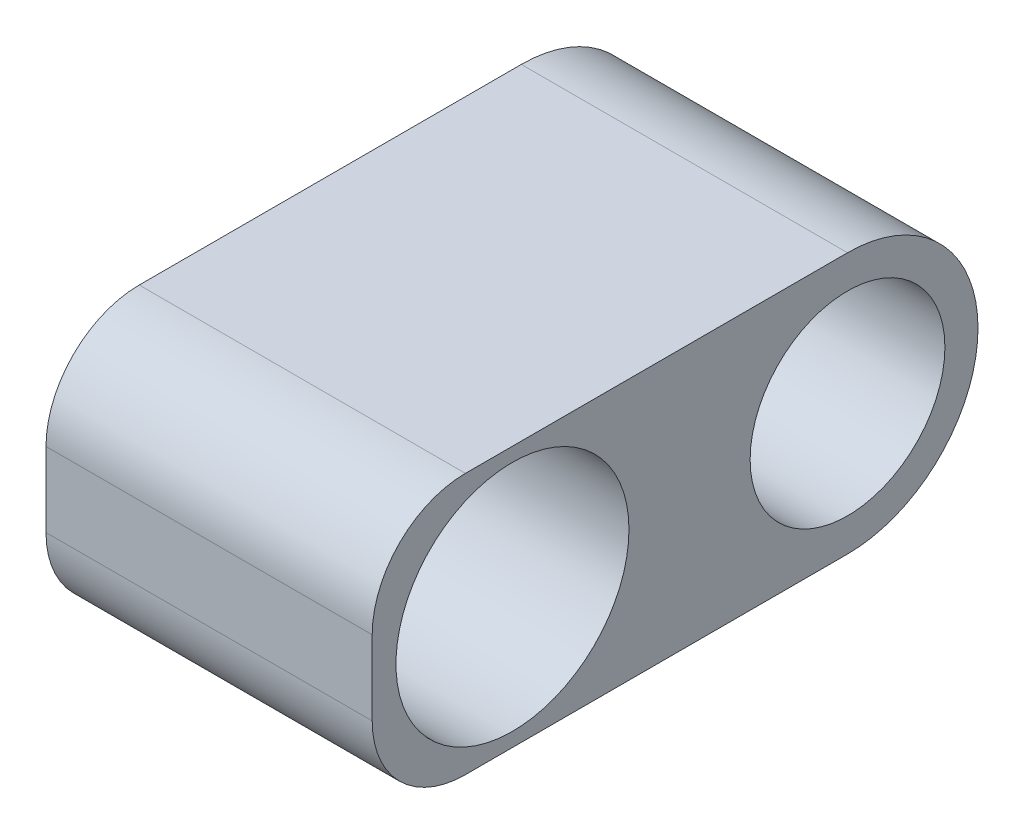
ISO-10303-21;
HEADER;
FILE_DESCRIPTION(('STEP AP214'),'2;1');
FILE_NAME('part.step','',(''),(''),'','','');
FILE_SCHEMA(('AUTOMOTIVE_DESIGN { 1 0 10303 214 1 1 1 1 }'));
ENDSEC;
DATA;
#1=APPLICATION_CONTEXT('core data for automotive mechanical design processes');
#2=APPLICATION_PROTOCOL_DEFINITION('international standard','automotive_design',2000,#1);
#3=PRODUCT_CONTEXT('',#1,'mechanical');
#4=PRODUCT('Part','Part','',(#3));
#5=PRODUCT_RELATED_PRODUCT_CATEGORY('part','',(#4));
#6=PRODUCT_DEFINITION_FORMATION('','',#4);
#7=PRODUCT_DEFINITION_CONTEXT('part definition',#1,'design');
#8=PRODUCT_DEFINITION('design','',#6,#7);
#9=PRODUCT_DEFINITION_SHAPE('','',#8);
#10=(LENGTH_UNIT() NAMED_UNIT(*) SI_UNIT(.MILLI.,.METRE.));
#11=(NAMED_UNIT(*) PLANE_ANGLE_UNIT() SI_UNIT($,.RADIAN.));
#12=(NAMED_UNIT(*) SI_UNIT($,.STERADIAN.) SOLID_ANGLE_UNIT());
#13=UNCERTAINTY_MEASURE_WITH_UNIT(LENGTH_MEASURE(1.E-05),#10,'distance_accuracy_value','');
#14=(GEOMETRIC_REPRESENTATION_CONTEXT(3) GLOBAL_UNCERTAINTY_ASSIGNED_CONTEXT((#13)) GLOBAL_UNIT_ASSIGNED_CONTEXT((#10,
#11,#12)) REPRESENTATION_CONTEXT('',''));
#15=CARTESIAN_POINT('',(0.,0.,0.));
#16=DIRECTION('',(0.,0.,1.));
#17=DIRECTION('',(1.,0.,0.));
#18=AXIS2_PLACEMENT_3D('',#15,#16,#17);
#19=CARTESIAN_POINT('',(-17.,-4.0000000000191,41.0000000000019));
#20=DIRECTION('',(1.,0.,0.));
#21=DIRECTION('',(0.,0.,-1.));
#22=AXIS2_PLACEMENT_3D('',#19,#20,#21);
#23=CYLINDRICAL_SURFACE('',#22,10.);
#24=DIRECTION('',(1.,0.,0.));
#25=VECTOR('',#24,1.);
#26=CARTESIAN_POINT('',(-17.,-4.0000000000191,51.0000000000019));
#27=LINE('',#26,#25);
#28=CARTESIAN_POINT('',(-17.,-4.0000000000191,51.0000000000019));
#29=VERTEX_POINT('',#28);
#30=CARTESIAN_POINT('',(18.,-4.0000000000191,51.0000000000019));
#31=VERTEX_POINT('',#30);
#32=EDGE_CURVE('E133',#29,#31,#27,.T.);
#33=ORIENTED_EDGE('',*,*,#32,.F.);
#34=CARTESIAN_POINT('',(-17.,-4.0000000000191,41.0000000000019));
#35=DIRECTION('',(-1.,0.,0.));
#36=DIRECTION('',(0.,0.,1.));
#37=AXIS2_PLACEMENT_3D('',#34,#35,#36);
#38=CIRCLE('',#37,10.);
#39=CARTESIAN_POINT('',(-17.,-14.00000000001,40.9999999999968));
#40=VERTEX_POINT('',#39);
#41=EDGE_CURVE('E46',#40,#29,#38,.T.);
#42=ORIENTED_EDGE('',*,*,#41,.F.);
#43=DIRECTION('',(1.,0.,0.));
#44=VECTOR('',#43,1.);
#45=CARTESIAN_POINT('',(-17.,-14.00000000001,40.9999999999968));
#46=LINE('',#45,#44);
#47=CARTESIAN_POINT('',(18.,-14.00000000001,40.9999999999968));
#48=VERTEX_POINT('',#47);
#49=EDGE_CURVE('E136',#48,#40,#46,.F.);
#50=ORIENTED_EDGE('',*,*,#49,.F.);
#51=CARTESIAN_POINT('',(18.,-4.0000000000191,41.0000000000019));
#52=DIRECTION('',(-1.,0.,0.));
#53=DIRECTION('',(0.,0.,1.));
#54=AXIS2_PLACEMENT_3D('',#51,#52,#53);
#55=CIRCLE('',#54,10.);
#56=EDGE_CURVE('E11',#31,#48,#55,.F.);
#57=ORIENTED_EDGE('',*,*,#56,.F.);
#58=EDGE_LOOP('',(#33,#42,#50,#57));
#59=FACE_BOUND('',#58,.T.);
#60=ADVANCED_FACE('F39',(#59),#23,.T.);
#61=CARTESIAN_POINT('',(-17.,4.0000000000191,41.0000000000019));
#62=DIRECTION('',(-1.,0.,0.));
#63=DIRECTION('',(0.,0.,1.));
#64=AXIS2_PLACEMENT_3D('',#61,#62,#63);
#65=CYLINDRICAL_SURFACE('',#64,10.);
#66=DIRECTION('',(-1.,0.,0.));
#67=VECTOR('',#66,1.);
#68=CARTESIAN_POINT('',(-17.,4.0000000000191,51.0000000000019));
#69=LINE('',#68,#67);
#70=CARTESIAN_POINT('',(18.,4.0000000000191,51.0000000000019));
#71=VERTEX_POINT('',#70);
#72=CARTESIAN_POINT('',(-17.,4.0000000000191,51.0000000000019));
#73=VERTEX_POINT('',#72);
#74=EDGE_CURVE('E121',#71,#73,#69,.T.);
#75=ORIENTED_EDGE('',*,*,#74,.F.);
#76=CARTESIAN_POINT('',(18.,4.0000000000191,41.0000000000019));
#77=DIRECTION('',(-1.,0.,0.));
#78=DIRECTION('',(0.,0.,1.));
#79=AXIS2_PLACEMENT_3D('',#76,#77,#78);
#80=CIRCLE('',#79,10.);
#81=CARTESIAN_POINT('',(18.,14.00000000001,40.9999999999968));
#82=VERTEX_POINT('',#81);
#83=EDGE_CURVE('E132',#82,#71,#80,.F.);
#84=ORIENTED_EDGE('',*,*,#83,.F.);
#85=DIRECTION('',(-1.,0.,0.));
#86=VECTOR('',#85,1.);
#87=CARTESIAN_POINT('',(-17.,14.00000000001,40.9999999999968));
#88=LINE('',#87,#86);
#89=CARTESIAN_POINT('',(-17.,14.00000000001,40.9999999999968));
#90=VERTEX_POINT('',#89);
#91=EDGE_CURVE('E130',#90,#82,#88,.F.);
#92=ORIENTED_EDGE('',*,*,#91,.F.);
#93=CARTESIAN_POINT('',(-17.,4.0000000000191,41.0000000000019));
#94=DIRECTION('',(-1.,0.,0.));
#95=DIRECTION('',(0.,0.,1.));
#96=AXIS2_PLACEMENT_3D('',#93,#94,#95);
#97=CIRCLE('',#96,10.);
#98=EDGE_CURVE('E135',#73,#90,#97,.T.);
#99=ORIENTED_EDGE('',*,*,#98,.F.);
#100=EDGE_LOOP('',(#75,#84,#92,#99));
#101=FACE_BOUND('',#100,.T.);
#102=ADVANCED_FACE('F149',(#101),#65,.T.);
#103=CARTESIAN_POINT('',(-17.,-14.00000000001,116758.401593134));
#104=DIRECTION('',(0.,-1.,0.));
#105=DIRECTION('',(0.,0.,-1.));
#106=AXIS2_PLACEMENT_3D('',#103,#104,#105);
#107=PLANE('',#106);
#108=DIRECTION('',(0.,0.,-1.));
#109=VECTOR('',#108,1.);
#110=CARTESIAN_POINT('',(18.,-14.00000000001,116758.401593134));
#111=LINE('',#110,#109);
#112=CARTESIAN_POINT('',(18.,-14.,0.));
#113=VERTEX_POINT('',#112);
#114=EDGE_CURVE('E89',#48,#113,#111,.T.);
#115=ORIENTED_EDGE('',*,*,#114,.F.);
#116=ORIENTED_EDGE('',*,*,#49,.T.);
#117=DIRECTION('',(0.,0.,-1.));
#118=VECTOR('',#117,1.);
#119=CARTESIAN_POINT('',(-17.,-14.00000000001,116758.401593134));
#120=LINE('',#119,#118);
#121=CARTESIAN_POINT('',(-17.,-14.,0.));
#122=VERTEX_POINT('',#121);
#123=EDGE_CURVE('E99',#40,#122,#120,.T.);
#124=ORIENTED_EDGE('',*,*,#123,.T.);
#125=DIRECTION('',(1.,0.,0.));
#126=VECTOR('',#125,1.);
#127=CARTESIAN_POINT('',(-17.,-14.,0.));
#128=LINE('',#127,#126);
#129=EDGE_CURVE('E97',#122,#113,#128,.T.);
#130=ORIENTED_EDGE('',*,*,#129,.T.);
#131=EDGE_LOOP('',(#115,#116,#124,#130));
#132=FACE_BOUND('',#131,.T.);
#133=ADVANCED_FACE('F96',(#132),#107,.T.);
#134=CARTESIAN_POINT('',(-17.,-481034.717744328,51.0000000000019));
#135=DIRECTION('',(0.,0.,1.));
#136=DIRECTION('',(1.,0.,0.));
#137=AXIS2_PLACEMENT_3D('',#134,#135,#136);
#138=PLANE('',#137);
#139=DIRECTION('',(0.,-1.,0.));
#140=VECTOR('',#139,1.);
#141=CARTESIAN_POINT('',(-17.,-481034.717744328,51.0000000000019));
#142=LINE('',#141,#140);
#143=EDGE_CURVE('E102',#73,#29,#142,.T.);
#144=ORIENTED_EDGE('',*,*,#143,.T.);
#145=ORIENTED_EDGE('',*,*,#32,.T.);
#146=DIRECTION('',(0.,-1.,0.));
#147=VECTOR('',#146,1.);
#148=CARTESIAN_POINT('',(18.,-481034.717744328,51.0000000000019));
#149=LINE('',#148,#147);
#150=EDGE_CURVE('E111',#71,#31,#149,.T.);
#151=ORIENTED_EDGE('',*,*,#150,.F.);
#152=ORIENTED_EDGE('',*,*,#74,.T.);
#153=EDGE_LOOP('',(#144,#145,#151,#152));
#154=FACE_BOUND('',#153,.T.);
#155=ADVANCED_FACE('F144',(#154),#138,.T.);
#156=CARTESIAN_POINT('',(-17.,14.00000000001,116758.401593134));
#157=DIRECTION('',(0.,1.,0.));
#158=DIRECTION('',(0.,0.,1.));
#159=AXIS2_PLACEMENT_3D('',#156,#157,#158);
#160=PLANE('',#159);
#161=DIRECTION('',(0.,0.,1.));
#162=VECTOR('',#161,1.);
#163=CARTESIAN_POINT('',(-17.,14.00000000001,116758.401593134));
#164=LINE('',#163,#162);
#165=CARTESIAN_POINT('',(-17.,14.00000000001,0.));
#166=VERTEX_POINT('',#165);
#167=EDGE_CURVE('E118',#166,#90,#164,.T.);
#168=ORIENTED_EDGE('',*,*,#167,.T.);
#169=ORIENTED_EDGE('',*,*,#91,.T.);
#170=DIRECTION('',(0.,0.,1.));
#171=VECTOR('',#170,1.);
#172=CARTESIAN_POINT('',(18.,14.00000000001,116758.401593134));
#173=LINE('',#172,#171);
#174=CARTESIAN_POINT('',(18.,14.00000000001,0.));
#175=VERTEX_POINT('',#174);
#176=EDGE_CURVE('E107',#175,#82,#173,.T.);
#177=ORIENTED_EDGE('',*,*,#176,.F.);
#178=DIRECTION('',(1.,0.,0.));
#179=VECTOR('',#178,1.);
#180=CARTESIAN_POINT('',(-17.,14.00000000001,0.));
#181=LINE('',#180,#179);
#182=EDGE_CURVE('E104',#166,#175,#181,.T.);
#183=ORIENTED_EDGE('',*,*,#182,.F.);
#184=EDGE_LOOP('',(#168,#169,#177,#183));
#185=FACE_BOUND('',#184,.T.);
#186=ADVANCED_FACE('F152',(#185),#160,.T.);
#187=CARTESIAN_POINT('',(-17.,0.,0.));
#188=DIRECTION('',(1.,0.,0.));
#189=DIRECTION('',(0.,0.,-1.));
#190=AXIS2_PLACEMENT_3D('',#187,#188,#189);
#191=CYLINDRICAL_SURFACE('',#190,14.);
#192=ORIENTED_EDGE('',*,*,#182,.T.);
#193=CARTESIAN_POINT('',(18.,0.,0.));
#194=DIRECTION('',(-1.,0.,0.));
#195=DIRECTION('',(0.,0.,1.));
#196=AXIS2_PLACEMENT_3D('',#193,#194,#195);
#197=CIRCLE('',#196,14.);
#198=EDGE_CURVE('E95',#175,#113,#197,.T.);
#199=ORIENTED_EDGE('',*,*,#198,.T.);
#200=ORIENTED_EDGE('',*,*,#129,.F.);
#201=CARTESIAN_POINT('',(-17.,0.,0.));
#202=DIRECTION('',(-1.,0.,0.));
#203=DIRECTION('',(0.,0.,1.));
#204=AXIS2_PLACEMENT_3D('',#201,#202,#203);
#205=CIRCLE('',#204,14.);
#206=EDGE_CURVE('E120',#166,#122,#205,.T.);
#207=ORIENTED_EDGE('',*,*,#206,.F.);
#208=EDGE_LOOP('',(#192,#199,#200,#207));
#209=FACE_BOUND('',#208,.T.);
#210=ADVANCED_FACE('F110',(#209),#191,.T.);
#211=CARTESIAN_POINT('',(-17.,0.,0.));
#212=DIRECTION('',(-1.,0.,0.));
#213=DIRECTION('',(0.,0.,1.));
#214=AXIS2_PLACEMENT_3D('',#211,#212,#213);
#215=PLANE('',#214);
#216=CARTESIAN_POINT('',(-17.,0.,35.95));
#217=DIRECTION('',(1.,0.,0.));
#218=DIRECTION('',(0.,0.,-1.));
#219=AXIS2_PLACEMENT_3D('',#216,#217,#218);
#220=CIRCLE('',#219,12.5);
#221=CARTESIAN_POINT('',(-17.,0.,23.45));
#222=VERTEX_POINT('',#221);
#223=EDGE_CURVE('E250',#222,#222,#220,.T.);
#224=ORIENTED_EDGE('',*,*,#223,.T.);
#225=EDGE_LOOP('',(#224));
#226=FACE_BOUND('',#225,.T.);
#227=CARTESIAN_POINT('',(-17.,0.,0.));
#228=DIRECTION('',(1.,0.,0.));
#229=DIRECTION('',(0.,0.,-1.));
#230=AXIS2_PLACEMENT_3D('',#227,#228,#229);
#231=CIRCLE('',#230,6.5);
#232=CARTESIAN_POINT('',(-17.,0.,-6.5));
#233=VERTEX_POINT('',#232);
#234=EDGE_CURVE('E253',#233,#233,#231,.T.);
#235=ORIENTED_EDGE('',*,*,#234,.T.);
#236=EDGE_LOOP('',(#235));
#237=FACE_BOUND('',#236,.T.);
#238=ORIENTED_EDGE('',*,*,#123,.F.);
#239=ORIENTED_EDGE('',*,*,#41,.T.);
#240=ORIENTED_EDGE('',*,*,#143,.F.);
#241=ORIENTED_EDGE('',*,*,#98,.T.);
#242=ORIENTED_EDGE('',*,*,#167,.F.);
#243=ORIENTED_EDGE('',*,*,#206,.T.);
#244=EDGE_LOOP('',(#238,#239,#240,#241,#242,#243));
#245=FACE_BOUND('',#244,.T.);
#246=ADVANCED_FACE('F142',(#226,#237,#245),#215,.T.);
#247=CARTESIAN_POINT('',(18.,0.,0.));
#248=DIRECTION('',(-1.,0.,0.));
#249=DIRECTION('',(0.,0.,1.));
#250=AXIS2_PLACEMENT_3D('',#247,#248,#249);
#251=PLANE('',#250);
#252=CARTESIAN_POINT('',(18.,0.,35.95));
#253=DIRECTION('',(1.,0.,0.));
#254=DIRECTION('',(0.,0.,-1.));
#255=AXIS2_PLACEMENT_3D('',#252,#253,#254);
#256=CIRCLE('',#255,12.5);
#257=CARTESIAN_POINT('',(18.,0.,23.45));
#258=VERTEX_POINT('',#257);
#259=EDGE_CURVE('E249',#258,#258,#256,.T.);
#260=ORIENTED_EDGE('',*,*,#259,.F.);
#261=EDGE_LOOP('',(#260));
#262=FACE_BOUND('',#261,.T.);
#263=CARTESIAN_POINT('',(18.,0.,0.));
#264=DIRECTION('',(1.,0.,0.));
#265=DIRECTION('',(0.,0.,-1.));
#266=AXIS2_PLACEMENT_3D('',#263,#264,#265);
#267=CIRCLE('',#266,10.45);
#268=CARTESIAN_POINT('',(18.,0.,-10.45));
#269=VERTEX_POINT('',#268);
#270=EDGE_CURVE('E260',#269,#269,#267,.T.);
#271=ORIENTED_EDGE('',*,*,#270,.F.);
#272=EDGE_LOOP('',(#271));
#273=FACE_BOUND('',#272,.T.);
#274=ORIENTED_EDGE('',*,*,#150,.T.);
#275=ORIENTED_EDGE('',*,*,#56,.T.);
#276=ORIENTED_EDGE('',*,*,#114,.T.);
#277=ORIENTED_EDGE('',*,*,#198,.F.);
#278=ORIENTED_EDGE('',*,*,#176,.T.);
#279=ORIENTED_EDGE('',*,*,#83,.T.);
#280=EDGE_LOOP('',(#274,#275,#276,#277,#278,#279));
#281=FACE_BOUND('',#280,.T.);
#282=ADVANCED_FACE('F86',(#262,#273,#281),#251,.F.);
#283=CARTESIAN_POINT('',(-14.,0.,0.));
#284=DIRECTION('',(1.,0.,0.));
#285=DIRECTION('',(0.,0.,-1.));
#286=AXIS2_PLACEMENT_3D('',#283,#284,#285);
#287=CYLINDRICAL_SURFACE('',#286,10.45);
#288=CARTESIAN_POINT('',(-14.,0.,0.));
#289=DIRECTION('',(1.,0.,0.));
#290=DIRECTION('',(0.,0.,-1.));
#291=AXIS2_PLACEMENT_3D('',#288,#289,#290);
#292=CIRCLE('',#291,10.45);
#293=CARTESIAN_POINT('',(-14.,0.,-10.45));
#294=VERTEX_POINT('',#293);
#295=EDGE_CURVE('E94',#294,#294,#292,.T.);
#296=ORIENTED_EDGE('',*,*,#295,.F.);
#297=EDGE_LOOP('',(#296));
#298=FACE_BOUND('',#297,.T.);
#299=ORIENTED_EDGE('',*,*,#270,.T.);
#300=EDGE_LOOP('',(#299));
#301=FACE_BOUND('',#300,.T.);
#302=ADVANCED_FACE('F192',(#298,#301),#287,.F.);
#303=CARTESIAN_POINT('',(-14.,0.,0.));
#304=DIRECTION('',(1.,0.,0.));
#305=DIRECTION('',(0.,0.,-1.));
#306=AXIS2_PLACEMENT_3D('',#303,#304,#305);
#307=PLANE('',#306);
#308=CARTESIAN_POINT('',(-14.,0.,0.));
#309=DIRECTION('',(1.,0.,0.));
#310=DIRECTION('',(0.,0.,-1.));
#311=AXIS2_PLACEMENT_3D('',#308,#309,#310);
#312=CIRCLE('',#311,6.5);
#313=CARTESIAN_POINT('',(-14.,0.,-6.5));
#314=VERTEX_POINT('',#313);
#315=EDGE_CURVE('E255',#314,#314,#312,.T.);
#316=ORIENTED_EDGE('',*,*,#315,.F.);
#317=EDGE_LOOP('',(#316));
#318=FACE_BOUND('',#317,.T.);
#319=ORIENTED_EDGE('',*,*,#295,.T.);
#320=EDGE_LOOP('',(#319));
#321=FACE_BOUND('',#320,.T.);
#322=ADVANCED_FACE('F204',(#318,#321),#307,.T.);
#323=CARTESIAN_POINT('',(-17.,0.,0.));
#324=DIRECTION('',(1.,0.,0.));
#325=DIRECTION('',(0.,0.,-1.));
#326=AXIS2_PLACEMENT_3D('',#323,#324,#325);
#327=CYLINDRICAL_SURFACE('',#326,6.5);
#328=CARTESIAN_POINT('',(-17.,0.,-6.5));
#329=CARTESIAN_POINT('',(-16.96875,0.,-6.5));
#330=CARTESIAN_POINT('',(-16.9375,0.,-6.5));
#331=CARTESIAN_POINT('',(-16.875,0.,-6.5));
#332=CARTESIAN_POINT('',(-16.84375,0.,-6.5));
#333=CARTESIAN_POINT('',(-16.78125,0.,-6.5));
#334=CARTESIAN_POINT('',(-16.75,0.,-6.5));
#335=CARTESIAN_POINT('',(-16.6875,0.,-6.5));
#336=CARTESIAN_POINT('',(-16.65625,0.,-6.5));
#337=CARTESIAN_POINT('',(-16.59375,0.,-6.5));
#338=CARTESIAN_POINT('',(-16.5625,0.,-6.5));
#339=CARTESIAN_POINT('',(-16.5,0.,-6.5));
#340=CARTESIAN_POINT('',(-16.46875,0.,-6.5));
#341=CARTESIAN_POINT('',(-16.40625,0.,-6.5));
#342=CARTESIAN_POINT('',(-16.375,0.,-6.5));
#343=CARTESIAN_POINT('',(-16.3125,0.,-6.5));
#344=CARTESIAN_POINT('',(-16.28125,0.,-6.5));
#345=CARTESIAN_POINT('',(-16.21875,0.,-6.5));
#346=CARTESIAN_POINT('',(-16.1875,0.,-6.5));
#347=CARTESIAN_POINT('',(-16.125,0.,-6.5));
#348=CARTESIAN_POINT('',(-16.09375,0.,-6.5));
#349=CARTESIAN_POINT('',(-16.03125,0.,-6.5));
#350=CARTESIAN_POINT('',(-16.,0.,-6.5));
#351=CARTESIAN_POINT('',(-15.9375,0.,-6.5));
#352=CARTESIAN_POINT('',(-15.90625,0.,-6.5));
#353=CARTESIAN_POINT('',(-15.84375,0.,-6.5));
#354=CARTESIAN_POINT('',(-15.8125,0.,-6.5));
#355=CARTESIAN_POINT('',(-15.75,0.,-6.5));
#356=CARTESIAN_POINT('',(-15.71875,0.,-6.5));
#357=CARTESIAN_POINT('',(-15.65625,0.,-6.5));
#358=CARTESIAN_POINT('',(-15.625,0.,-6.5));
#359=CARTESIAN_POINT('',(-15.5625,0.,-6.5));
#360=CARTESIAN_POINT('',(-15.53125,0.,-6.5));
#361=CARTESIAN_POINT('',(-15.46875,0.,-6.5));
#362=CARTESIAN_POINT('',(-15.4375,0.,-6.5));
#363=CARTESIAN_POINT('',(-15.375,0.,-6.5));
#364=CARTESIAN_POINT('',(-15.34375,0.,-6.5));
#365=CARTESIAN_POINT('',(-15.28125,0.,-6.5));
#366=CARTESIAN_POINT('',(-15.25,0.,-6.5));
#367=CARTESIAN_POINT('',(-15.1875,0.,-6.5));
#368=CARTESIAN_POINT('',(-15.15625,0.,-6.5));
#369=CARTESIAN_POINT('',(-15.09375,0.,-6.5));
#370=CARTESIAN_POINT('',(-15.0625,0.,-6.5));
#371=CARTESIAN_POINT('',(-15.,0.,-6.5));
#372=CARTESIAN_POINT('',(-14.96875,0.,-6.5));
#373=CARTESIAN_POINT('',(-14.90625,0.,-6.5));
#374=CARTESIAN_POINT('',(-14.875,0.,-6.5));
#375=CARTESIAN_POINT('',(-14.8125,0.,-6.5));
#376=CARTESIAN_POINT('',(-14.78125,0.,-6.5));
#377=CARTESIAN_POINT('',(-14.71875,0.,-6.5));
#378=CARTESIAN_POINT('',(-14.6875,0.,-6.5));
#379=CARTESIAN_POINT('',(-14.625,0.,-6.5));
#380=CARTESIAN_POINT('',(-14.59375,0.,-6.5));
#381=CARTESIAN_POINT('',(-14.53125,0.,-6.5));
#382=CARTESIAN_POINT('',(-14.5,0.,-6.5));
#383=CARTESIAN_POINT('',(-14.4375,0.,-6.5));
#384=CARTESIAN_POINT('',(-14.40625,0.,-6.5));
#385=CARTESIAN_POINT('',(-14.34375,0.,-6.5));
#386=CARTESIAN_POINT('',(-14.3125,0.,-6.5));
#387=CARTESIAN_POINT('',(-14.25,0.,-6.5));
#388=CARTESIAN_POINT('',(-14.21875,0.,-6.5));
#389=CARTESIAN_POINT('',(-14.15625,0.,-6.5));
#390=CARTESIAN_POINT('',(-14.125,0.,-6.5));
#391=CARTESIAN_POINT('',(-14.0625,0.,-6.5));
#392=CARTESIAN_POINT('',(-14.03125,0.,-6.5));
#393=CARTESIAN_POINT('',(-14.,0.,-6.5));
#394=B_SPLINE_CURVE_WITH_KNOTS('',3,(#328,#329,#330,#331,#332,#333,#334,#335,#336,#337,#338,
#339,#340,#341,#342,#343,#344,#345,#346,#347,#348,#349,#350,#351,#352,#353,#354,#355,#356,#357,
#358,#359,#360,#361,#362,#363,#364,#365,#366,#367,#368,#369,#370,#371,#372,#373,#374,#375,#376,
#377,#378,#379,#380,#381,#382,#383,#384,#385,#386,#387,#388,#389,#390,#391,#392,#393),
.UNSPECIFIED.,.F.,.F.,(4,2,2,2,2,2,2,2,2,2,2,2,2,2,2,2,2,2,2,2,2,2,2,2,2,2,2,2,2,2,2,2,4),(0.,
0.0937499999999966,0.187499999999997,0.281249999999997,0.374999999999997,0.468749999999997,
0.562499999999997,0.656249999999997,0.749999999999997,0.843749999999997,0.937499999999997,
1.03125,1.12499999999999,1.21874999999999,1.31249999999999,1.40624999999999,1.49999999999999,
1.59374999999999,1.68749999999999,1.78124999999999,1.87499999999999,1.96874999999999,
2.06249999999999,2.15624999999999,2.24999999999999,2.34374999999999,2.43749999999999,
2.53124999999999,2.62499999999999,2.71874999999999,2.81249999999999,2.90624999999999,
2.99999999999999),.UNSPECIFIED.);
#395=EDGE_CURVE('BSEAM211',#233,#314,#394,.T.);
#396=ORIENTED_EDGE('',*,*,#234,.F.);
#397=ORIENTED_EDGE('',*,*,#315,.T.);
#398=ORIENTED_EDGE('',*,*,#395,.T.);
#399=ORIENTED_EDGE('',*,*,#395,.F.);
#400=EDGE_LOOP('',(#396,#398,#397,#399));
#401=FACE_BOUND('',#400,.T.);
#402=ADVANCED_FACE('F211',(#401),#327,.F.);
#403=CARTESIAN_POINT('',(-17.,0.,35.95));
#404=DIRECTION('',(1.,0.,0.));
#405=DIRECTION('',(0.,0.,-1.));
#406=AXIS2_PLACEMENT_3D('',#403,#404,#405);
#407=CYLINDRICAL_SURFACE('',#406,12.5);
#408=ORIENTED_EDGE('',*,*,#223,.F.);
#409=EDGE_LOOP('',(#408));
#410=FACE_BOUND('',#409,.T.);
#411=ORIENTED_EDGE('',*,*,#259,.T.);
#412=EDGE_LOOP('',(#411));
#413=FACE_BOUND('',#412,.T.);
#414=ADVANCED_FACE('F224',(#410,#413),#407,.F.);
#415=CLOSED_SHELL('',(#60,#102,#133,#155,#186,#210,#246,#282,#302,#322,#402,#414));
#416=MANIFOLD_SOLID_BREP('B2',#415);
#417=ADVANCED_BREP_SHAPE_REPRESENTATION('',(#18,#416),#14);
#418=SHAPE_DEFINITION_REPRESENTATION(#9,#417);
ENDSEC;
END-ISO-10303-21;
